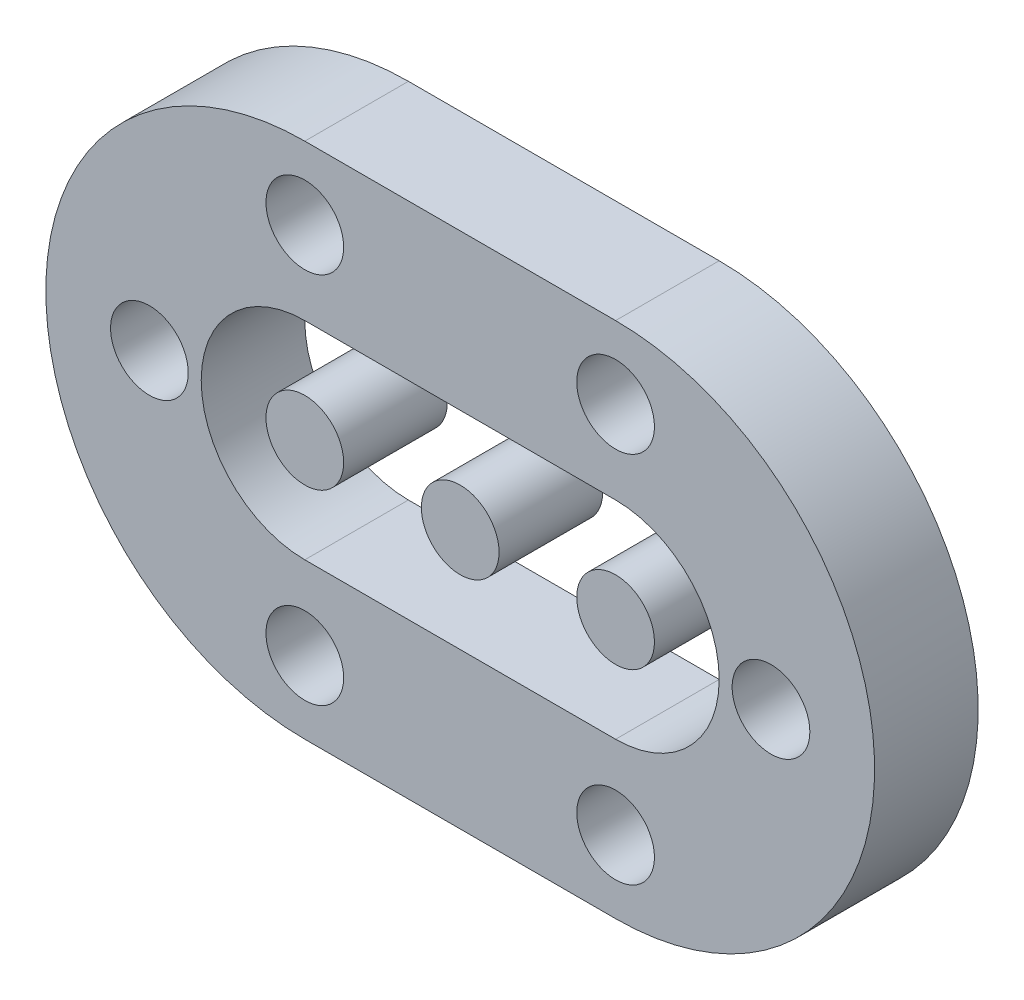
ISO-10303-21;
HEADER;
FILE_DESCRIPTION(('STEP AP214'),'2;1');
FILE_NAME('part.step','',(''),(''),'','','');
FILE_SCHEMA(('AUTOMOTIVE_DESIGN { 1 0 10303 214 1 1 1 1 }'));
ENDSEC;
DATA;
#1=APPLICATION_CONTEXT('core data for automotive mechanical design processes');
#2=APPLICATION_PROTOCOL_DEFINITION('international standard','automotive_design',2000,#1);
#3=PRODUCT_CONTEXT('',#1,'mechanical');
#4=PRODUCT('Part','Part','',(#3));
#5=PRODUCT_RELATED_PRODUCT_CATEGORY('part','',(#4));
#6=PRODUCT_DEFINITION_FORMATION('','',#4);
#7=PRODUCT_DEFINITION_CONTEXT('part definition',#1,'design');
#8=PRODUCT_DEFINITION('design','',#6,#7);
#9=PRODUCT_DEFINITION_SHAPE('','',#8);
#10=(LENGTH_UNIT() NAMED_UNIT(*) SI_UNIT(.MILLI.,.METRE.));
#11=(NAMED_UNIT(*) PLANE_ANGLE_UNIT() SI_UNIT($,.RADIAN.));
#12=(NAMED_UNIT(*) SI_UNIT($,.STERADIAN.) SOLID_ANGLE_UNIT());
#13=UNCERTAINTY_MEASURE_WITH_UNIT(LENGTH_MEASURE(1.E-05),#10,'distance_accuracy_value','');
#14=(GEOMETRIC_REPRESENTATION_CONTEXT(3) GLOBAL_UNCERTAINTY_ASSIGNED_CONTEXT((#13)) GLOBAL_UNIT_ASSIGNED_CONTEXT((#10,
#11,#12)) REPRESENTATION_CONTEXT('',''));
#15=CARTESIAN_POINT('',(0.,0.,0.));
#16=DIRECTION('',(0.,0.,1.));
#17=DIRECTION('',(1.,0.,0.));
#18=AXIS2_PLACEMENT_3D('',#15,#16,#17);
#19=CARTESIAN_POINT('',(-15.,0.,10.));
#20=DIRECTION('',(0.,0.,-1.));
#21=DIRECTION('',(-1.,0.,0.));
#22=AXIS2_PLACEMENT_3D('',#19,#20,#21);
#23=CYLINDRICAL_SURFACE('',#22,3.75000000000001);
#24=CARTESIAN_POINT('',(-15.,0.,10.));
#25=DIRECTION('',(0.,0.,1.));
#26=DIRECTION('',(1.,0.,0.));
#27=AXIS2_PLACEMENT_3D('',#24,#25,#26);
#28=CIRCLE('',#27,3.75000000000001);
#29=CARTESIAN_POINT('',(-11.25,0.,10.));
#30=VERTEX_POINT('',#29);
#31=EDGE_CURVE('E97',#30,#30,#28,.T.);
#32=ORIENTED_EDGE('',*,*,#31,.F.);
#33=EDGE_LOOP('',(#32));
#34=FACE_BOUND('',#33,.T.);
#35=CARTESIAN_POINT('',(-15.,0.,0.));
#36=DIRECTION('',(0.,0.,1.));
#37=DIRECTION('',(1.,0.,0.));
#38=AXIS2_PLACEMENT_3D('',#35,#36,#37);
#39=CIRCLE('',#38,3.75000000000001);
#40=CARTESIAN_POINT('',(-11.25,0.,0.));
#41=VERTEX_POINT('',#40);
#42=EDGE_CURVE('E12',#41,#41,#39,.T.);
#43=ORIENTED_EDGE('',*,*,#42,.T.);
#44=EDGE_LOOP('',(#43));
#45=FACE_BOUND('',#44,.T.);
#46=ADVANCED_FACE('F93',(#34,#45),#23,.T.);
#47=CARTESIAN_POINT('',(-15.,0.,10.));
#48=DIRECTION('',(0.,0.,1.));
#49=DIRECTION('',(1.,0.,0.));
#50=AXIS2_PLACEMENT_3D('',#47,#48,#49);
#51=PLANE('',#50);
#52=ORIENTED_EDGE('',*,*,#31,.T.);
#53=EDGE_LOOP('',(#52));
#54=FACE_BOUND('',#53,.T.);
#55=ADVANCED_FACE('F95',(#54),#51,.T.);
#56=CARTESIAN_POINT('',(-15.,0.,0.));
#57=DIRECTION('',(0.,0.,1.));
#58=DIRECTION('',(1.,0.,0.));
#59=AXIS2_PLACEMENT_3D('',#56,#57,#58);
#60=PLANE('',#59);
#61=ORIENTED_EDGE('',*,*,#42,.F.);
#62=EDGE_LOOP('',(#61));
#63=FACE_BOUND('',#62,.T.);
#64=ADVANCED_FACE('F112',(#63),#60,.F.);
#65=CLOSED_SHELL('',(#46,#55,#64));
#66=MANIFOLD_SOLID_BREP('B2',#65);
#67=CARTESIAN_POINT('',(0.,0.,10.));
#68=DIRECTION('',(0.,0.,-1.));
#69=DIRECTION('',(-1.,0.,0.));
#70=AXIS2_PLACEMENT_3D('',#67,#68,#69);
#71=CYLINDRICAL_SURFACE('',#70,3.75000000000001);
#72=CARTESIAN_POINT('',(0.,0.,10.));
#73=DIRECTION('',(0.,0.,1.));
#74=DIRECTION('',(1.,0.,0.));
#75=AXIS2_PLACEMENT_3D('',#72,#73,#74);
#76=CIRCLE('',#75,3.75000000000001);
#77=CARTESIAN_POINT('',(3.75000000000001,0.,10.));
#78=VERTEX_POINT('',#77);
#79=EDGE_CURVE('E140',#78,#78,#76,.T.);
#80=ORIENTED_EDGE('',*,*,#79,.F.);
#81=EDGE_LOOP('',(#80));
#82=FACE_BOUND('',#81,.T.);
#83=CARTESIAN_POINT('',(0.,0.,0.));
#84=DIRECTION('',(0.,0.,1.));
#85=DIRECTION('',(1.,0.,0.));
#86=AXIS2_PLACEMENT_3D('',#83,#84,#85);
#87=CIRCLE('',#86,3.75000000000001);
#88=CARTESIAN_POINT('',(3.75000000000001,0.,0.));
#89=VERTEX_POINT('',#88);
#90=EDGE_CURVE('E92',#89,#89,#87,.T.);
#91=ORIENTED_EDGE('',*,*,#90,.T.);
#92=EDGE_LOOP('',(#91));
#93=FACE_BOUND('',#92,.T.);
#94=ADVANCED_FACE('F136',(#82,#93),#71,.T.);
#95=CARTESIAN_POINT('',(0.,0.,10.));
#96=DIRECTION('',(0.,0.,1.));
#97=DIRECTION('',(1.,0.,0.));
#98=AXIS2_PLACEMENT_3D('',#95,#96,#97);
#99=PLANE('',#98);
#100=ORIENTED_EDGE('',*,*,#79,.T.);
#101=EDGE_LOOP('',(#100));
#102=FACE_BOUND('',#101,.T.);
#103=ADVANCED_FACE('F138',(#102),#99,.T.);
#104=CARTESIAN_POINT('',(0.,0.,0.));
#105=DIRECTION('',(0.,0.,1.));
#106=DIRECTION('',(1.,0.,0.));
#107=AXIS2_PLACEMENT_3D('',#104,#105,#106);
#108=PLANE('',#107);
#109=ORIENTED_EDGE('',*,*,#90,.F.);
#110=EDGE_LOOP('',(#109));
#111=FACE_BOUND('',#110,.T.);
#112=ADVANCED_FACE('F155',(#111),#108,.F.);
#113=CLOSED_SHELL('',(#94,#103,#112));
#114=MANIFOLD_SOLID_BREP('B7',#113);
#115=CARTESIAN_POINT('',(-30.,0.,10.));
#116=DIRECTION('',(0.,0.,-1.));
#117=DIRECTION('',(-1.,0.,0.));
#118=AXIS2_PLACEMENT_3D('',#115,#116,#117);
#119=CYLINDRICAL_SURFACE('',#118,3.75000000000001);
#120=CARTESIAN_POINT('',(-30.,0.,10.));
#121=DIRECTION('',(0.,0.,1.));
#122=DIRECTION('',(1.,0.,0.));
#123=AXIS2_PLACEMENT_3D('',#120,#121,#122);
#124=CIRCLE('',#123,3.75000000000001);
#125=CARTESIAN_POINT('',(-26.25,0.,10.));
#126=VERTEX_POINT('',#125);
#127=EDGE_CURVE('E184',#126,#126,#124,.T.);
#128=ORIENTED_EDGE('',*,*,#127,.F.);
#129=EDGE_LOOP('',(#128));
#130=FACE_BOUND('',#129,.T.);
#131=CARTESIAN_POINT('',(-30.,0.,0.));
#132=DIRECTION('',(0.,0.,1.));
#133=DIRECTION('',(1.,0.,0.));
#134=AXIS2_PLACEMENT_3D('',#131,#132,#133);
#135=CIRCLE('',#134,3.75000000000001);
#136=CARTESIAN_POINT('',(-26.25,0.,0.));
#137=VERTEX_POINT('',#136);
#138=EDGE_CURVE('E135',#137,#137,#135,.T.);
#139=ORIENTED_EDGE('',*,*,#138,.T.);
#140=EDGE_LOOP('',(#139));
#141=FACE_BOUND('',#140,.T.);
#142=ADVANCED_FACE('F180',(#130,#141),#119,.T.);
#143=CARTESIAN_POINT('',(0.,0.,10.));
#144=DIRECTION('',(0.,0.,1.));
#145=DIRECTION('',(1.,0.,0.));
#146=AXIS2_PLACEMENT_3D('',#143,#144,#145);
#147=PLANE('',#146);
#148=ORIENTED_EDGE('',*,*,#127,.T.);
#149=EDGE_LOOP('',(#148));
#150=FACE_BOUND('',#149,.T.);
#151=ADVANCED_FACE('F182',(#150),#147,.T.);
#152=CARTESIAN_POINT('',(0.,0.,0.));
#153=DIRECTION('',(0.,0.,1.));
#154=DIRECTION('',(1.,0.,0.));
#155=AXIS2_PLACEMENT_3D('',#152,#153,#154);
#156=PLANE('',#155);
#157=ORIENTED_EDGE('',*,*,#138,.F.);
#158=EDGE_LOOP('',(#157));
#159=FACE_BOUND('',#158,.T.);
#160=ADVANCED_FACE('F199',(#159),#156,.F.);
#161=CLOSED_SHELL('',(#142,#151,#160));
#162=MANIFOLD_SOLID_BREP('B87',#161);
#163=CARTESIAN_POINT('',(0.,-25.,10.));
#164=DIRECTION('',(0.,-1.,0.));
#165=DIRECTION('',(1.,0.,0.));
#166=AXIS2_PLACEMENT_3D('',#163,#164,#165);
#167=PLANE('',#166);
#168=DIRECTION('',(-1.,0.,0.));
#169=VECTOR('',#168,1.);
#170=CARTESIAN_POINT('',(0.,-25.,0.));
#171=LINE('',#170,#169);
#172=CARTESIAN_POINT('',(0.,-25.,0.));
#173=VERTEX_POINT('',#172);
#174=CARTESIAN_POINT('',(-30.,-25.,0.));
#175=VERTEX_POINT('',#174);
#176=EDGE_CURVE('E328',#173,#175,#171,.T.);
#177=ORIENTED_EDGE('',*,*,#176,.F.);
#178=DIRECTION('',(0.,0.,-1.));
#179=VECTOR('',#178,1.);
#180=CARTESIAN_POINT('',(0.,-25.,10.));
#181=LINE('',#180,#179);
#182=CARTESIAN_POINT('',(0.,-25.,10.));
#183=VERTEX_POINT('',#182);
#184=EDGE_CURVE('E178',#183,#173,#181,.T.);
#185=ORIENTED_EDGE('',*,*,#184,.F.);
#186=DIRECTION('',(-1.,0.,0.));
#187=VECTOR('',#186,1.);
#188=CARTESIAN_POINT('',(0.,-25.,10.));
#189=LINE('',#188,#187);
#190=CARTESIAN_POINT('',(-30.,-25.,10.));
#191=VERTEX_POINT('',#190);
#192=EDGE_CURVE('E302',#183,#191,#189,.T.);
#193=ORIENTED_EDGE('',*,*,#192,.T.);
#194=DIRECTION('',(0.,0.,-1.));
#195=VECTOR('',#194,1.);
#196=CARTESIAN_POINT('',(-30.,-25.,10.));
#197=LINE('',#196,#195);
#198=EDGE_CURVE('E268',#191,#175,#197,.T.);
#199=ORIENTED_EDGE('',*,*,#198,.T.);
#200=EDGE_LOOP('',(#177,#185,#193,#199));
#201=FACE_BOUND('',#200,.T.);
#202=ADVANCED_FACE('F215',(#201),#167,.T.);
#203=CARTESIAN_POINT('',(0.,0.,10.));
#204=DIRECTION('',(0.,0.,-1.));
#205=DIRECTION('',(-1.,0.,0.));
#206=AXIS2_PLACEMENT_3D('',#203,#204,#205);
#207=CYLINDRICAL_SURFACE('',#206,25.);
#208=CARTESIAN_POINT('',(0.,0.,0.));
#209=DIRECTION('',(0.,0.,1.));
#210=DIRECTION('',(1.,0.,0.));
#211=AXIS2_PLACEMENT_3D('',#208,#209,#210);
#212=CIRCLE('',#211,25.);
#213=CARTESIAN_POINT('',(0.,25.,0.));
#214=VERTEX_POINT('',#213);
#215=EDGE_CURVE('E307',#173,#214,#212,.T.);
#216=ORIENTED_EDGE('',*,*,#215,.T.);
#217=DIRECTION('',(0.,0.,-1.));
#218=VECTOR('',#217,1.);
#219=CARTESIAN_POINT('',(0.,25.,10.));
#220=LINE('',#219,#218);
#221=CARTESIAN_POINT('',(0.,25.,10.));
#222=VERTEX_POINT('',#221);
#223=EDGE_CURVE('E225',#222,#214,#220,.T.);
#224=ORIENTED_EDGE('',*,*,#223,.F.);
#225=CARTESIAN_POINT('',(0.,0.,10.));
#226=DIRECTION('',(0.,0.,1.));
#227=DIRECTION('',(1.,0.,0.));
#228=AXIS2_PLACEMENT_3D('',#225,#226,#227);
#229=CIRCLE('',#228,25.);
#230=EDGE_CURVE('E298',#183,#222,#229,.T.);
#231=ORIENTED_EDGE('',*,*,#230,.F.);
#232=ORIENTED_EDGE('',*,*,#184,.T.);
#233=EDGE_LOOP('',(#216,#224,#231,#232));
#234=FACE_BOUND('',#233,.T.);
#235=ADVANCED_FACE('F305',(#234),#207,.T.);
#236=CARTESIAN_POINT('',(0.,25.,10.));
#237=DIRECTION('',(0.,-1.,0.));
#238=DIRECTION('',(0.,0.,-1.));
#239=AXIS2_PLACEMENT_3D('',#236,#237,#238);
#240=PLANE('',#239);
#241=DIRECTION('',(-1.,0.,0.));
#242=VECTOR('',#241,1.);
#243=CARTESIAN_POINT('',(0.,25.,0.));
#244=LINE('',#243,#242);
#245=CARTESIAN_POINT('',(-30.,25.,0.));
#246=VERTEX_POINT('',#245);
#247=EDGE_CURVE('E325',#214,#246,#244,.T.);
#248=ORIENTED_EDGE('',*,*,#247,.T.);
#249=DIRECTION('',(0.,0.,-1.));
#250=VECTOR('',#249,1.);
#251=CARTESIAN_POINT('',(-30.,25.,10.));
#252=LINE('',#251,#250);
#253=CARTESIAN_POINT('',(-30.,25.,10.));
#254=VERTEX_POINT('',#253);
#255=EDGE_CURVE('E297',#254,#246,#252,.T.);
#256=ORIENTED_EDGE('',*,*,#255,.F.);
#257=DIRECTION('',(-1.,0.,0.));
#258=VECTOR('',#257,1.);
#259=CARTESIAN_POINT('',(0.,25.,10.));
#260=LINE('',#259,#258);
#261=EDGE_CURVE('E291',#222,#254,#260,.T.);
#262=ORIENTED_EDGE('',*,*,#261,.F.);
#263=ORIENTED_EDGE('',*,*,#223,.T.);
#264=EDGE_LOOP('',(#248,#256,#262,#263));
#265=FACE_BOUND('',#264,.T.);
#266=ADVANCED_FACE('F294',(#265),#240,.F.);
#267=CARTESIAN_POINT('',(-30.,0.,10.));
#268=DIRECTION('',(0.,0.,-1.));
#269=DIRECTION('',(-1.,0.,0.));
#270=AXIS2_PLACEMENT_3D('',#267,#268,#269);
#271=CYLINDRICAL_SURFACE('',#270,10.);
#272=CARTESIAN_POINT('',(-30.,0.,0.));
#273=DIRECTION('',(0.,0.,1.));
#274=DIRECTION('',(1.,0.,0.));
#275=AXIS2_PLACEMENT_3D('',#272,#273,#274);
#276=CIRCLE('',#275,10.);
#277=CARTESIAN_POINT('',(-30.,9.99999999999999,0.));
#278=VERTEX_POINT('',#277);
#279=CARTESIAN_POINT('',(-30.,-10.,0.));
#280=VERTEX_POINT('',#279);
#281=EDGE_CURVE('E339',#278,#280,#276,.T.);
#282=ORIENTED_EDGE('',*,*,#281,.F.);
#283=DIRECTION('',(0.,0.,-1.));
#284=VECTOR('',#283,1.);
#285=CARTESIAN_POINT('',(-30.,9.99999999999999,10.));
#286=LINE('',#285,#284);
#287=CARTESIAN_POINT('',(-30.,9.99999999999999,10.));
#288=VERTEX_POINT('',#287);
#289=EDGE_CURVE('E219',#288,#278,#286,.T.);
#290=ORIENTED_EDGE('',*,*,#289,.F.);
#291=CARTESIAN_POINT('',(-30.,0.,10.));
#292=DIRECTION('',(0.,0.,1.));
#293=DIRECTION('',(1.,0.,0.));
#294=AXIS2_PLACEMENT_3D('',#291,#292,#293);
#295=CIRCLE('',#294,10.);
#296=CARTESIAN_POINT('',(-30.,-10.,10.));
#297=VERTEX_POINT('',#296);
#298=EDGE_CURVE('E368',#288,#297,#295,.T.);
#299=ORIENTED_EDGE('',*,*,#298,.T.);
#300=DIRECTION('',(0.,0.,-1.));
#301=VECTOR('',#300,1.);
#302=CARTESIAN_POINT('',(-30.,-10.,10.));
#303=LINE('',#302,#301);
#304=EDGE_CURVE('E312',#297,#280,#303,.T.);
#305=ORIENTED_EDGE('',*,*,#304,.T.);
#306=EDGE_LOOP('',(#282,#290,#299,#305));
#307=FACE_BOUND('',#306,.T.);
#308=ADVANCED_FACE('F415',(#307),#271,.F.);
#309=CARTESIAN_POINT('',(0.,10.,10.));
#310=DIRECTION('',(0.,-1.,0.));
#311=DIRECTION('',(1.,0.,0.));
#312=AXIS2_PLACEMENT_3D('',#309,#310,#311);
#313=PLANE('',#312);
#314=DIRECTION('',(-1.,0.,0.));
#315=VECTOR('',#314,1.);
#316=CARTESIAN_POINT('',(0.,10.,0.));
#317=LINE('',#316,#315);
#318=CARTESIAN_POINT('',(0.,10.,0.));
#319=VERTEX_POINT('',#318);
#320=EDGE_CURVE('E336',#319,#278,#317,.T.);
#321=ORIENTED_EDGE('',*,*,#320,.F.);
#322=DIRECTION('',(0.,0.,-1.));
#323=VECTOR('',#322,1.);
#324=CARTESIAN_POINT('',(0.,10.,10.));
#325=LINE('',#324,#323);
#326=CARTESIAN_POINT('',(0.,10.,10.));
#327=VERTEX_POINT('',#326);
#328=EDGE_CURVE('E315',#327,#319,#325,.T.);
#329=ORIENTED_EDGE('',*,*,#328,.F.);
#330=DIRECTION('',(-1.,0.,0.));
#331=VECTOR('',#330,1.);
#332=CARTESIAN_POINT('',(0.,10.,10.));
#333=LINE('',#332,#331);
#334=EDGE_CURVE('E366',#327,#288,#333,.T.);
#335=ORIENTED_EDGE('',*,*,#334,.T.);
#336=ORIENTED_EDGE('',*,*,#289,.T.);
#337=EDGE_LOOP('',(#321,#329,#335,#336));
#338=FACE_BOUND('',#337,.T.);
#339=ADVANCED_FACE('F409',(#338),#313,.T.);
#340=CARTESIAN_POINT('',(0.,0.,10.));
#341=DIRECTION('',(0.,0.,-1.));
#342=DIRECTION('',(-1.,0.,0.));
#343=AXIS2_PLACEMENT_3D('',#340,#341,#342);
#344=CYLINDRICAL_SURFACE('',#343,10.);
#345=CARTESIAN_POINT('',(0.,0.,0.));
#346=DIRECTION('',(0.,0.,1.));
#347=DIRECTION('',(1.,0.,0.));
#348=AXIS2_PLACEMENT_3D('',#345,#346,#347);
#349=CIRCLE('',#348,10.);
#350=CARTESIAN_POINT('',(0.,-10.,0.));
#351=VERTEX_POINT('',#350);
#352=EDGE_CURVE('E333',#351,#319,#349,.T.);
#353=ORIENTED_EDGE('',*,*,#352,.F.);
#354=DIRECTION('',(0.,0.,-1.));
#355=VECTOR('',#354,1.);
#356=CARTESIAN_POINT('',(0.,-10.,10.));
#357=LINE('',#356,#355);
#358=CARTESIAN_POINT('',(0.,-10.,10.));
#359=VERTEX_POINT('',#358);
#360=EDGE_CURVE('E314',#359,#351,#357,.T.);
#361=ORIENTED_EDGE('',*,*,#360,.F.);
#362=CARTESIAN_POINT('',(0.,0.,10.));
#363=DIRECTION('',(0.,0.,1.));
#364=DIRECTION('',(1.,0.,0.));
#365=AXIS2_PLACEMENT_3D('',#362,#363,#364);
#366=CIRCLE('',#365,10.);
#367=EDGE_CURVE('E364',#359,#327,#366,.T.);
#368=ORIENTED_EDGE('',*,*,#367,.T.);
#369=ORIENTED_EDGE('',*,*,#328,.T.);
#370=EDGE_LOOP('',(#353,#361,#368,#369));
#371=FACE_BOUND('',#370,.T.);
#372=ADVANCED_FACE('F412',(#371),#344,.F.);
#373=CARTESIAN_POINT('',(0.,-10.,10.));
#374=DIRECTION('',(0.,-1.,0.));
#375=DIRECTION('',(1.,0.,0.));
#376=AXIS2_PLACEMENT_3D('',#373,#374,#375);
#377=PLANE('',#376);
#378=DIRECTION('',(-1.,0.,0.));
#379=VECTOR('',#378,1.);
#380=CARTESIAN_POINT('',(0.,-10.,0.));
#381=LINE('',#380,#379);
#382=EDGE_CURVE('E330',#351,#280,#381,.T.);
#383=ORIENTED_EDGE('',*,*,#382,.T.);
#384=ORIENTED_EDGE('',*,*,#304,.F.);
#385=DIRECTION('',(-1.,0.,0.));
#386=VECTOR('',#385,1.);
#387=CARTESIAN_POINT('',(0.,-10.,10.));
#388=LINE('',#387,#386);
#389=EDGE_CURVE('E362',#359,#297,#388,.T.);
#390=ORIENTED_EDGE('',*,*,#389,.F.);
#391=ORIENTED_EDGE('',*,*,#360,.T.);
#392=EDGE_LOOP('',(#383,#384,#390,#391));
#393=FACE_BOUND('',#392,.T.);
#394=ADVANCED_FACE('F414',(#393),#377,.F.);
#395=CARTESIAN_POINT('',(-45.,0.,10.));
#396=DIRECTION('',(0.,0.,-1.));
#397=DIRECTION('',(-1.,0.,0.));
#398=AXIS2_PLACEMENT_3D('',#395,#396,#397);
#399=CYLINDRICAL_SURFACE('',#398,3.75000000000001);
#400=CARTESIAN_POINT('',(-45.,0.,10.));
#401=DIRECTION('',(0.,0.,1.));
#402=DIRECTION('',(1.,0.,0.));
#403=AXIS2_PLACEMENT_3D('',#400,#401,#402);
#404=CIRCLE('',#403,3.75000000000001);
#405=CARTESIAN_POINT('',(-41.25,0.,10.));
#406=VERTEX_POINT('',#405);
#407=EDGE_CURVE('E370',#406,#406,#404,.T.);
#408=ORIENTED_EDGE('',*,*,#407,.T.);
#409=EDGE_LOOP('',(#408));
#410=FACE_BOUND('',#409,.T.);
#411=CARTESIAN_POINT('',(-45.,0.,0.));
#412=DIRECTION('',(0.,0.,1.));
#413=DIRECTION('',(1.,0.,0.));
#414=AXIS2_PLACEMENT_3D('',#411,#412,#413);
#415=CIRCLE('',#414,3.75000000000001);
#416=CARTESIAN_POINT('',(-41.25,0.,0.));
#417=VERTEX_POINT('',#416);
#418=EDGE_CURVE('E342',#417,#417,#415,.T.);
#419=ORIENTED_EDGE('',*,*,#418,.F.);
#420=EDGE_LOOP('',(#419));
#421=FACE_BOUND('',#420,.T.);
#422=ADVANCED_FACE('F434',(#410,#421),#399,.F.);
#423=CARTESIAN_POINT('',(15.,0.,10.));
#424=DIRECTION('',(0.,0.,-1.));
#425=DIRECTION('',(-1.,0.,0.));
#426=AXIS2_PLACEMENT_3D('',#423,#424,#425);
#427=CYLINDRICAL_SURFACE('',#426,3.75000000000001);
#428=CARTESIAN_POINT('',(15.,0.,10.));
#429=DIRECTION('',(0.,0.,1.));
#430=DIRECTION('',(1.,0.,0.));
#431=AXIS2_PLACEMENT_3D('',#428,#429,#430);
#432=CIRCLE('',#431,3.75000000000001);
#433=CARTESIAN_POINT('',(18.75,0.,10.));
#434=VERTEX_POINT('',#433);
#435=EDGE_CURVE('E373',#434,#434,#432,.T.);
#436=ORIENTED_EDGE('',*,*,#435,.T.);
#437=EDGE_LOOP('',(#436));
#438=FACE_BOUND('',#437,.T.);
#439=CARTESIAN_POINT('',(15.,0.,0.));
#440=DIRECTION('',(0.,0.,1.));
#441=DIRECTION('',(1.,0.,0.));
#442=AXIS2_PLACEMENT_3D('',#439,#440,#441);
#443=CIRCLE('',#442,3.75000000000001);
#444=CARTESIAN_POINT('',(18.75,0.,0.));
#445=VERTEX_POINT('',#444);
#446=EDGE_CURVE('E345',#445,#445,#443,.T.);
#447=ORIENTED_EDGE('',*,*,#446,.F.);
#448=EDGE_LOOP('',(#447));
#449=FACE_BOUND('',#448,.T.);
#450=ADVANCED_FACE('F450',(#438,#449),#427,.F.);
#451=CARTESIAN_POINT('',(-30.0000000000001,18.,10.));
#452=DIRECTION('',(0.,0.,-1.));
#453=DIRECTION('',(-1.,0.,0.));
#454=AXIS2_PLACEMENT_3D('',#451,#452,#453);
#455=CYLINDRICAL_SURFACE('',#454,3.75000000000001);
#456=CARTESIAN_POINT('',(-30.0000000000001,18.,10.));
#457=DIRECTION('',(0.,0.,1.));
#458=DIRECTION('',(1.,0.,0.));
#459=AXIS2_PLACEMENT_3D('',#456,#457,#458);
#460=CIRCLE('',#459,3.75000000000001);
#461=CARTESIAN_POINT('',(-26.2500000000001,18.,10.));
#462=VERTEX_POINT('',#461);
#463=EDGE_CURVE('E376',#462,#462,#460,.T.);
#464=ORIENTED_EDGE('',*,*,#463,.T.);
#465=EDGE_LOOP('',(#464));
#466=FACE_BOUND('',#465,.T.);
#467=CARTESIAN_POINT('',(-30.0000000000001,18.,0.));
#468=DIRECTION('',(0.,0.,1.));
#469=DIRECTION('',(1.,0.,0.));
#470=AXIS2_PLACEMENT_3D('',#467,#468,#469);
#471=CIRCLE('',#470,3.75000000000001);
#472=CARTESIAN_POINT('',(-26.2500000000001,18.,0.));
#473=VERTEX_POINT('',#472);
#474=EDGE_CURVE('E348',#473,#473,#471,.T.);
#475=ORIENTED_EDGE('',*,*,#474,.F.);
#476=EDGE_LOOP('',(#475));
#477=FACE_BOUND('',#476,.T.);
#478=ADVANCED_FACE('F457',(#466,#477),#455,.F.);
#479=CARTESIAN_POINT('',(0.,18.,10.));
#480=DIRECTION('',(0.,0.,-1.));
#481=DIRECTION('',(-1.,0.,0.));
#482=AXIS2_PLACEMENT_3D('',#479,#480,#481);
#483=CYLINDRICAL_SURFACE('',#482,3.75000000000001);
#484=CARTESIAN_POINT('',(0.,18.,10.));
#485=DIRECTION('',(0.,0.,1.));
#486=DIRECTION('',(1.,0.,0.));
#487=AXIS2_PLACEMENT_3D('',#484,#485,#486);
#488=CIRCLE('',#487,3.75000000000001);
#489=CARTESIAN_POINT('',(3.74999999999994,18.,10.));
#490=VERTEX_POINT('',#489);
#491=EDGE_CURVE('E379',#490,#490,#488,.T.);
#492=ORIENTED_EDGE('',*,*,#491,.T.);
#493=EDGE_LOOP('',(#492));
#494=FACE_BOUND('',#493,.T.);
#495=CARTESIAN_POINT('',(0.,18.,0.));
#496=DIRECTION('',(0.,0.,1.));
#497=DIRECTION('',(1.,0.,0.));
#498=AXIS2_PLACEMENT_3D('',#495,#496,#497);
#499=CIRCLE('',#498,3.75000000000001);
#500=CARTESIAN_POINT('',(3.74999999999994,18.,0.));
#501=VERTEX_POINT('',#500);
#502=EDGE_CURVE('E351',#501,#501,#499,.T.);
#503=ORIENTED_EDGE('',*,*,#502,.F.);
#504=EDGE_LOOP('',(#503));
#505=FACE_BOUND('',#504,.T.);
#506=ADVANCED_FACE('F465',(#494,#505),#483,.F.);
#507=CARTESIAN_POINT('',(-29.9999999999998,-18.,10.));
#508=DIRECTION('',(0.,0.,-1.));
#509=DIRECTION('',(-1.,0.,0.));
#510=AXIS2_PLACEMENT_3D('',#507,#508,#509);
#511=CYLINDRICAL_SURFACE('',#510,3.75000000000001);
#512=CARTESIAN_POINT('',(-29.9999999999998,-18.,10.));
#513=DIRECTION('',(0.,0.,1.));
#514=DIRECTION('',(1.,0.,0.));
#515=AXIS2_PLACEMENT_3D('',#512,#513,#514);
#516=CIRCLE('',#515,3.75000000000001);
#517=CARTESIAN_POINT('',(-26.2499999999998,-18.,10.));
#518=VERTEX_POINT('',#517);
#519=EDGE_CURVE('E382',#518,#518,#516,.T.);
#520=ORIENTED_EDGE('',*,*,#519,.T.);
#521=EDGE_LOOP('',(#520));
#522=FACE_BOUND('',#521,.T.);
#523=CARTESIAN_POINT('',(-29.9999999999998,-18.,0.));
#524=DIRECTION('',(0.,0.,1.));
#525=DIRECTION('',(1.,0.,0.));
#526=AXIS2_PLACEMENT_3D('',#523,#524,#525);
#527=CIRCLE('',#526,3.75000000000001);
#528=CARTESIAN_POINT('',(-26.2499999999998,-18.,0.));
#529=VERTEX_POINT('',#528);
#530=EDGE_CURVE('E354',#529,#529,#527,.T.);
#531=ORIENTED_EDGE('',*,*,#530,.F.);
#532=EDGE_LOOP('',(#531));
#533=FACE_BOUND('',#532,.T.);
#534=ADVANCED_FACE('F473',(#522,#533),#511,.F.);
#535=CARTESIAN_POINT('',(1.88539992297529E-13,-18.,10.));
#536=DIRECTION('',(0.,0.,-1.));
#537=DIRECTION('',(-1.,0.,0.));
#538=AXIS2_PLACEMENT_3D('',#535,#536,#537);
#539=CYLINDRICAL_SURFACE('',#538,3.75000000000001);
#540=CARTESIAN_POINT('',(1.88539992297529E-13,-18.,10.));
#541=DIRECTION('',(0.,0.,1.));
#542=DIRECTION('',(1.,0.,0.));
#543=AXIS2_PLACEMENT_3D('',#540,#541,#542);
#544=CIRCLE('',#543,3.75000000000001);
#545=CARTESIAN_POINT('',(3.75000000000019,-18.,10.));
#546=VERTEX_POINT('',#545);
#547=EDGE_CURVE('E324',#546,#546,#544,.T.);
#548=ORIENTED_EDGE('',*,*,#547,.T.);
#549=EDGE_LOOP('',(#548));
#550=FACE_BOUND('',#549,.T.);
#551=CARTESIAN_POINT('',(1.88539992297529E-13,-18.,0.));
#552=DIRECTION('',(0.,0.,1.));
#553=DIRECTION('',(1.,0.,0.));
#554=AXIS2_PLACEMENT_3D('',#551,#552,#553);
#555=CIRCLE('',#554,3.75000000000001);
#556=CARTESIAN_POINT('',(3.75000000000019,-18.,0.));
#557=VERTEX_POINT('',#556);
#558=EDGE_CURVE('E357',#557,#557,#555,.T.);
#559=ORIENTED_EDGE('',*,*,#558,.F.);
#560=EDGE_LOOP('',(#559));
#561=FACE_BOUND('',#560,.T.);
#562=ADVANCED_FACE('F217',(#550,#561),#539,.F.);
#563=CARTESIAN_POINT('',(-30.,0.,10.));
#564=DIRECTION('',(0.,0.,-1.));
#565=DIRECTION('',(-1.,0.,0.));
#566=AXIS2_PLACEMENT_3D('',#563,#564,#565);
#567=CYLINDRICAL_SURFACE('',#566,25.);
#568=CARTESIAN_POINT('',(-30.,0.,0.));
#569=DIRECTION('',(0.,0.,1.));
#570=DIRECTION('',(1.,0.,0.));
#571=AXIS2_PLACEMENT_3D('',#568,#569,#570);
#572=CIRCLE('',#571,25.);
#573=EDGE_CURVE('E261',#246,#175,#572,.T.);
#574=ORIENTED_EDGE('',*,*,#573,.T.);
#575=ORIENTED_EDGE('',*,*,#198,.F.);
#576=CARTESIAN_POINT('',(-30.,0.,10.));
#577=DIRECTION('',(0.,0.,1.));
#578=DIRECTION('',(1.,0.,0.));
#579=AXIS2_PLACEMENT_3D('',#576,#577,#578);
#580=CIRCLE('',#579,25.);
#581=EDGE_CURVE('E234',#254,#191,#580,.T.);
#582=ORIENTED_EDGE('',*,*,#581,.F.);
#583=ORIENTED_EDGE('',*,*,#255,.T.);
#584=EDGE_LOOP('',(#574,#575,#582,#583));
#585=FACE_BOUND('',#584,.T.);
#586=ADVANCED_FACE('F393',(#585),#567,.T.);
#587=CARTESIAN_POINT('',(0.,0.,10.));
#588=DIRECTION('',(0.,0.,1.));
#589=DIRECTION('',(1.,0.,0.));
#590=AXIS2_PLACEMENT_3D('',#587,#588,#589);
#591=PLANE('',#590);
#592=ORIENTED_EDGE('',*,*,#547,.F.);
#593=EDGE_LOOP('',(#592));
#594=FACE_BOUND('',#593,.T.);
#595=ORIENTED_EDGE('',*,*,#519,.F.);
#596=EDGE_LOOP('',(#595));
#597=FACE_BOUND('',#596,.T.);
#598=ORIENTED_EDGE('',*,*,#491,.F.);
#599=EDGE_LOOP('',(#598));
#600=FACE_BOUND('',#599,.T.);
#601=ORIENTED_EDGE('',*,*,#463,.F.);
#602=EDGE_LOOP('',(#601));
#603=FACE_BOUND('',#602,.T.);
#604=ORIENTED_EDGE('',*,*,#435,.F.);
#605=EDGE_LOOP('',(#604));
#606=FACE_BOUND('',#605,.T.);
#607=ORIENTED_EDGE('',*,*,#407,.F.);
#608=EDGE_LOOP('',(#607));
#609=FACE_BOUND('',#608,.T.);
#610=ORIENTED_EDGE('',*,*,#298,.F.);
#611=ORIENTED_EDGE('',*,*,#334,.F.);
#612=ORIENTED_EDGE('',*,*,#367,.F.);
#613=ORIENTED_EDGE('',*,*,#389,.T.);
#614=EDGE_LOOP('',(#610,#611,#612,#613));
#615=FACE_BOUND('',#614,.T.);
#616=ORIENTED_EDGE('',*,*,#192,.F.);
#617=ORIENTED_EDGE('',*,*,#230,.T.);
#618=ORIENTED_EDGE('',*,*,#261,.T.);
#619=ORIENTED_EDGE('',*,*,#581,.T.);
#620=EDGE_LOOP('',(#616,#617,#618,#619));
#621=FACE_BOUND('',#620,.T.);
#622=ADVANCED_FACE('F301',(#594,#597,#600,#603,#606,#609,#615,#621),#591,.T.);
#623=CARTESIAN_POINT('',(0.,0.,0.));
#624=DIRECTION('',(0.,0.,1.));
#625=DIRECTION('',(1.,0.,0.));
#626=AXIS2_PLACEMENT_3D('',#623,#624,#625);
#627=PLANE('',#626);
#628=ORIENTED_EDGE('',*,*,#558,.T.);
#629=EDGE_LOOP('',(#628));
#630=FACE_BOUND('',#629,.T.);
#631=ORIENTED_EDGE('',*,*,#530,.T.);
#632=EDGE_LOOP('',(#631));
#633=FACE_BOUND('',#632,.T.);
#634=ORIENTED_EDGE('',*,*,#502,.T.);
#635=EDGE_LOOP('',(#634));
#636=FACE_BOUND('',#635,.T.);
#637=ORIENTED_EDGE('',*,*,#474,.T.);
#638=EDGE_LOOP('',(#637));
#639=FACE_BOUND('',#638,.T.);
#640=ORIENTED_EDGE('',*,*,#446,.T.);
#641=EDGE_LOOP('',(#640));
#642=FACE_BOUND('',#641,.T.);
#643=ORIENTED_EDGE('',*,*,#418,.T.);
#644=EDGE_LOOP('',(#643));
#645=FACE_BOUND('',#644,.T.);
#646=ORIENTED_EDGE('',*,*,#281,.T.);
#647=ORIENTED_EDGE('',*,*,#382,.F.);
#648=ORIENTED_EDGE('',*,*,#352,.T.);
#649=ORIENTED_EDGE('',*,*,#320,.T.);
#650=EDGE_LOOP('',(#646,#647,#648,#649));
#651=FACE_BOUND('',#650,.T.);
#652=ORIENTED_EDGE('',*,*,#176,.T.);
#653=ORIENTED_EDGE('',*,*,#573,.F.);
#654=ORIENTED_EDGE('',*,*,#247,.F.);
#655=ORIENTED_EDGE('',*,*,#215,.F.);
#656=EDGE_LOOP('',(#652,#653,#654,#655));
#657=FACE_BOUND('',#656,.T.);
#658=ADVANCED_FACE('F392',(#630,#633,#636,#639,#642,#645,#651,#657),#627,.F.);
#659=CLOSED_SHELL('',(#202,#235,#266,#308,#339,#372,#394,#422,#450,#478,#506,#534,#562,#586,
#622,#658));
#660=MANIFOLD_SOLID_BREP('B130',#659);
#661=ADVANCED_BREP_SHAPE_REPRESENTATION('',(#18,#66,#114,#162,#660),#14);
#662=SHAPE_DEFINITION_REPRESENTATION(#9,#661);
ENDSEC;
END-ISO-10303-21;
